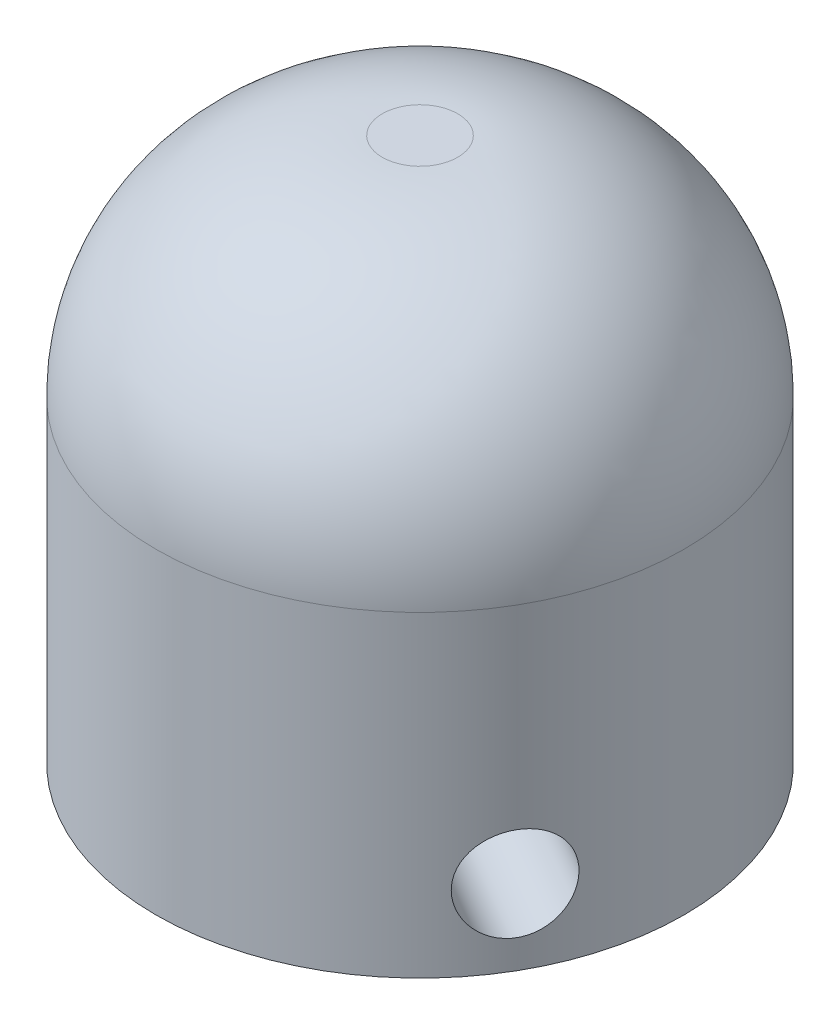
ISO-10303-21;
HEADER;
FILE_DESCRIPTION(('STEP AP214'),'2;1');
FILE_NAME('part.step','',(''),(''),'','','');
FILE_SCHEMA(('AUTOMOTIVE_DESIGN { 1 0 10303 214 1 1 1 1 }'));
ENDSEC;
DATA;
#1=APPLICATION_CONTEXT('core data for automotive mechanical design processes');
#2=APPLICATION_PROTOCOL_DEFINITION('international standard','automotive_design',2000,#1);
#3=PRODUCT_CONTEXT('',#1,'mechanical');
#4=PRODUCT('Part','Part','',(#3));
#5=PRODUCT_RELATED_PRODUCT_CATEGORY('part','',(#4));
#6=PRODUCT_DEFINITION_FORMATION('','',#4);
#7=PRODUCT_DEFINITION_CONTEXT('part definition',#1,'design');
#8=PRODUCT_DEFINITION('design','',#6,#7);
#9=PRODUCT_DEFINITION_SHAPE('','',#8);
#10=(LENGTH_UNIT() NAMED_UNIT(*) SI_UNIT(.MILLI.,.METRE.));
#11=(NAMED_UNIT(*) PLANE_ANGLE_UNIT() SI_UNIT($,.RADIAN.));
#12=(NAMED_UNIT(*) SI_UNIT($,.STERADIAN.) SOLID_ANGLE_UNIT());
#13=UNCERTAINTY_MEASURE_WITH_UNIT(LENGTH_MEASURE(1.E-05),#10,'distance_accuracy_value','');
#14=(GEOMETRIC_REPRESENTATION_CONTEXT(3) GLOBAL_UNCERTAINTY_ASSIGNED_CONTEXT((#13)) GLOBAL_UNIT_ASSIGNED_CONTEXT((#10,
#11,#12)) REPRESENTATION_CONTEXT('',''));
#15=CARTESIAN_POINT('',(0.,0.,0.));
#16=DIRECTION('',(0.,0.,1.));
#17=DIRECTION('',(1.,0.,0.));
#18=AXIS2_PLACEMENT_3D('',#15,#16,#17);
#19=CARTESIAN_POINT('',(0.,35.9903810567665,0.));
#20=DIRECTION('',(0.,1.,0.));
#21=DIRECTION('',(0.,0.,1.));
#22=AXIS2_PLACEMENT_3D('',#19,#20,#21);
#23=PLANE('',#22);
#24=CARTESIAN_POINT('',(0.,35.9903810567665,0.));
#25=DIRECTION('',(0.,1.,0.));
#26=DIRECTION('',(0.,0.,1.));
#27=AXIS2_PLACEMENT_3D('',#24,#25,#26);
#28=CIRCLE('',#27,2.5);
#29=CARTESIAN_POINT('',(0.,35.9903810567665,2.5));
#30=VERTEX_POINT('',#29);
#31=EDGE_CURVE('E11',#30,#30,#28,.T.);
#32=ORIENTED_EDGE('',*,*,#31,.T.);
#33=EDGE_LOOP('',(#32));
#34=FACE_BOUND('',#33,.T.);
#35=ADVANCED_FACE('F33',(#34),#23,.T.);
#36=CARTESIAN_POINT('',(0.,0.,0.));
#37=DIRECTION('',(0.,-1.,0.));
#38=DIRECTION('',(0.,0.,-1.));
#39=AXIS2_PLACEMENT_3D('',#36,#37,#38);
#40=CYLINDRICAL_SURFACE('',#39,17.5);
#41=CARTESIAN_POINT('',(0.,20.9903810567665,0.));
#42=DIRECTION('',(0.,1.,0.));
#43=DIRECTION('',(0.,0.,1.));
#44=AXIS2_PLACEMENT_3D('',#41,#42,#43);
#45=CIRCLE('',#44,17.5);
#46=CARTESIAN_POINT('',(0.,20.9903810567665,17.5));
#47=VERTEX_POINT('',#46);
#48=EDGE_CURVE('E40',#47,#47,#45,.F.);
#49=ORIENTED_EDGE('',*,*,#48,.T.);
#50=EDGE_LOOP('',(#49));
#51=FACE_BOUND('',#50,.T.);
#52=CARTESIAN_POINT('',(-15.1554445662278,8.1,8.74999999999986));
#53=CARTESIAN_POINT('',(-15.2417820479246,8.09999322777987,8.60045298639503));
#54=CARTESIAN_POINT('',(-15.3259334918145,8.08552295754015,8.44953976264709));
#55=CARTESIAN_POINT('',(-15.4875797478547,8.02805471124324,8.14947833958834));
#56=CARTESIAN_POINT('',(-15.5650686163546,7.9850315555295,8.00033181652896));
#57=CARTESIAN_POINT('',(-15.7116253248353,7.87180661171829,7.70853243627809));
#58=CARTESIAN_POINT('',(-15.7807003383229,7.80162819201587,7.56587411332213));
#59=CARTESIAN_POINT('',(-15.909420644273,7.63614858520618,7.2913205109295));
#60=CARTESIAN_POINT('',(-15.9690668592936,7.54084985842512,7.15942417910065));
#61=CARTESIAN_POINT('',(-16.0788881502649,7.32674685067589,6.90928514203029));
#62=CARTESIAN_POINT('',(-16.1289665986782,7.2077252753214,6.79118598371038));
#63=CARTESIAN_POINT('',(-16.2187074540842,6.95002276055288,6.57399203234935));
#64=CARTESIAN_POINT('',(-16.2583691605673,6.81134049995379,6.47489851752872));
#65=CARTESIAN_POINT('',(-16.3275196989504,6.51705061892162,6.29850541934801));
#66=CARTESIAN_POINT('',(-16.3569352862118,6.36133118918651,6.22136344592394));
#67=CARTESIAN_POINT('',(-16.4053112213827,6.03813831609258,6.09266123389642));
#68=CARTESIAN_POINT('',(-16.4242723702447,5.87066577429098,6.04109903556363));
#69=CARTESIAN_POINT('',(-16.4517177077557,5.53055916978101,5.96595206894152));
#70=CARTESIAN_POINT('',(-16.4603084286591,5.3579965774798,5.94208291914247));
#71=CARTESIAN_POINT('',(-16.4674333391695,5.01107755870246,5.92231011886453));
#72=CARTESIAN_POINT('',(-16.4659683329282,4.83672127678028,5.9264042321762));
#73=CARTESIAN_POINT('',(-16.4530486489479,4.49331801846067,5.96217521759061));
#74=CARTESIAN_POINT('',(-16.441711048418,4.32423279112567,5.99352881785334));
#75=CARTESIAN_POINT('',(-16.4091246515356,3.99400745816796,6.08217380620037));
#76=CARTESIAN_POINT('',(-16.3878754753201,3.83286765731691,6.13946618839078));
#77=CARTESIAN_POINT('',(-16.3352082110285,3.52210520378114,6.27825477445738));
#78=CARTESIAN_POINT('',(-16.3037359199212,3.37254932321537,6.35987979603029));
#79=CARTESIAN_POINT('',(-16.2305651018696,3.08993446119829,6.54435427795358));
#80=CARTESIAN_POINT('',(-16.1888656453205,2.956876981036,6.64720566755373));
#81=CARTESIAN_POINT('',(-16.094617277954,2.70907828164315,6.87228885944131));
#82=CARTESIAN_POINT('',(-16.0419243341542,2.59462028378147,6.99477236325941));
#83=CARTESIAN_POINT('',(-15.9263617299006,2.38950341571159,7.25404113598676));
#84=CARTESIAN_POINT('',(-15.8634919871223,2.29884473804165,7.39082652058677));
#85=CARTESIAN_POINT('',(-15.7282227495744,2.1438664506886,7.67448329895881));
#86=CARTESIAN_POINT('',(-15.6558135201002,2.07957402623888,7.82136492135094));
#87=CARTESIAN_POINT('',(-15.502789283047,1.97942755674712,8.12045026280921));
#88=CARTESIAN_POINT('',(-15.4221750530016,1.94357081986927,8.27265347668768));
#89=CARTESIAN_POINT('',(-15.2557401388279,1.90170252244976,8.57565578072303));
#90=CARTESIAN_POINT('',(-15.1700024103793,1.89530252748827,8.72644681967691));
#91=CARTESIAN_POINT('',(-14.9947676667449,1.91149070016137,9.02423334178259));
#92=CARTESIAN_POINT('',(-14.9052708158457,1.93407760224012,9.17122899035371));
#93=CARTESIAN_POINT('',(-14.7259940898605,2.00727537073196,9.45638870894169));
#94=CARTESIAN_POINT('',(-14.6362204254473,2.05769185502988,9.59460670431768));
#95=CARTESIAN_POINT('',(-14.4588660986888,2.18490890230455,9.85985140073953));
#96=CARTESIAN_POINT('',(-14.3712855727728,2.26171110231314,9.98687740679352));
#97=CARTESIAN_POINT('',(-14.2007025619413,2.44039443187866,10.2280056419099));
#98=CARTESIAN_POINT('',(-14.1177537969066,2.54251561907226,10.3419679319803));
#99=CARTESIAN_POINT('',(-13.9606709513426,2.76861050590975,10.5530569225806));
#100=CARTESIAN_POINT('',(-13.8865376006607,2.89258601281425,10.650182229444));
#101=CARTESIAN_POINT('',(-13.7494108108952,3.16062066100812,10.8266508208191));
#102=CARTESIAN_POINT('',(-13.6865588473049,3.30489913030973,10.9057712175324));
#103=CARTESIAN_POINT('',(-13.5759814530026,3.6084257696733,11.0431216110718));
#104=CARTESIAN_POINT('',(-13.5282554999732,3.76767342258713,11.1013523292501));
#105=CARTESIAN_POINT('',(-13.4504483293857,4.09591369476502,11.1954981104349));
#106=CARTESIAN_POINT('',(-13.4202880285956,4.26485881564327,11.2315132354532));
#107=CARTESIAN_POINT('',(-13.3788291722728,4.60828055228973,11.2808681875322));
#108=CARTESIAN_POINT('',(-13.3675287411066,4.78275661624107,11.2942102694531));
#109=CARTESIAN_POINT('',(-13.3644037360474,5.12964980084326,11.297907518837));
#110=CARTESIAN_POINT('',(-13.3723061409326,5.30206116648191,11.2885849261952));
#111=CARTESIAN_POINT('',(-13.4066073457234,5.64236479588035,11.2478254476681));
#112=CARTESIAN_POINT('',(-13.433006062159,5.81025708003029,11.2163886615797));
#113=CARTESIAN_POINT('',(-13.502919359495,6.13656521725581,11.1321218426897));
#114=CARTESIAN_POINT('',(-13.5464084685195,6.29499477081708,11.0793236439385));
#115=CARTESIAN_POINT('',(-13.6484283144127,6.59835273241795,10.9533986659335));
#116=CARTESIAN_POINT('',(-13.7069599539737,6.74328032950272,10.8802706666803));
#117=CARTESIAN_POINT('',(-13.837309190252,7.01761142250047,10.7140165050136));
#118=CARTESIAN_POINT('',(-13.9092941488813,7.14678113718678,10.6206357443457));
#119=CARTESIAN_POINT('',(-14.0629269659538,7.38381748474896,10.4163518224946));
#120=CARTESIAN_POINT('',(-14.1445770438729,7.49167920927066,10.3054446346163));
#121=CARTESIAN_POINT('',(-14.3148768403992,7.68382666122884,10.0675641177387));
#122=CARTESIAN_POINT('',(-14.4035768171296,7.76791915535067,9.94047064567867));
#123=CARTESIAN_POINT('',(-14.583892418577,7.9088373906953,9.67397881174471));
#124=CARTESIAN_POINT('',(-14.6755051275477,7.96568953762116,9.53459252190264));
#125=CARTESIAN_POINT('',(-14.8326065638476,8.03856027749216,9.28756408831413));
#126=CARTESIAN_POINT('',(-14.8982077614067,8.06156207947105,9.18199788432531));
#127=CARTESIAN_POINT('',(-15.0280766984198,8.0922842550959,8.96786433085468));
#128=CARTESIAN_POINT('',(-15.0923444658354,8.10000494950468,8.85929704441651));
#129=CARTESIAN_POINT('',(-15.1554445662278,8.1,8.74999999999986));
#130=B_SPLINE_CURVE_WITH_KNOTS('',3,(#52,#53,#54,#55,#56,#57,#58,#59,#60,#61,#62,#63,#64,#65,
#66,#67,#68,#69,#70,#71,#72,#73,#74,#75,#76,#77,#78,#79,#80,#81,#82,#83,#84,#85,#86,#87,#88,#89,
#90,#91,#92,#93,#94,#95,#96,#97,#98,#99,#100,#101,#102,#103,#104,#105,#106,#107,#108,#109,#110,
#111,#112,#113,#114,#115,#116,#117,#118,#119,#120,#121,#122,#123,#124,#125,#126,#127,#128,#129),
.UNSPECIFIED.,.T.,.F.,(4,2,2,2,2,2,2,2,2,2,2,2,2,2,2,2,2,2,2,2,2,2,2,2,2,2,2,2,2,2,2,2,2,2,2,2,
2,2,4),(0.,0.517579340975336,1.03561572220724,1.55320729639994,2.0707481956046,2.5932676070605,
3.11582214813436,3.64203900788229,4.16821554663686,4.68893953774941,5.20962188728867,
5.72421238278261,6.23882260167246,6.75620708372197,7.27363861121162,7.79833094846839,
8.32302753039414,8.84826375488365,9.37345025247608,9.8916910981442,10.4099093184027,
10.924552904673,11.4392284264091,11.9589840234571,12.4787826222947,13.0047028338504,
13.5306048828415,14.0541205635889,14.5775841770534,15.0936489661138,15.6097114262919,
16.1250076357004,16.6403347749161,17.1625602626801,17.6849059066088,18.2113832730641,
18.7373492557209,19.115632167171,19.4939071380722),.UNSPECIFIED.);
#131=CARTESIAN_POINT('',(-15.1554445662278,8.1,8.74999999999986));
#132=VERTEX_POINT('',#131);
#133=EDGE_CURVE('E134',#132,#132,#130,.T.);
#134=ORIENTED_EDGE('',*,*,#133,.F.);
#135=EDGE_LOOP('',(#134));
#136=FACE_BOUND('',#135,.T.);
#137=CARTESIAN_POINT('',(15.1554445662276,8.1,8.75000000000007));
#138=CARTESIAN_POINT('',(15.0691017942342,8.09999322777987,8.89954395925073));
#139=CARTESIAN_POINT('',(14.9804828306464,8.08552295754015,9.04787785929845));
#140=CARTESIAN_POINT('',(14.8014451436019,8.02805471124324,9.33789833498532));
#141=CARTESIAN_POINT('',(14.7110248999963,7.9850315555295,9.47957892514645));
#142=CARTESIAN_POINT('',(14.5315975781309,7.8718066117183,9.7524004479112));
#143=CARTESIAN_POINT('',(14.4425893531335,7.80162819201588,9.88355032583616));
#144=CARTESIAN_POINT('',(14.269179111736,7.63614858520618,10.1323021819682));
#145=CARTESIAN_POINT('',(14.1847766452165,7.54084985842512,10.24990548533));
#146=CARTESIAN_POINT('',(14.0230605301211,7.32674685067589,10.4700830317228));
#147=CARTESIAN_POINT('',(13.9458228830572,7.2077252753214,10.5725018193908));
#148=CARTESIAN_POINT('',(13.8025978313332,6.95002276055288,10.7588166556102));
#149=CARTESIAN_POINT('',(13.7366111833898,6.81134049995379,10.8427114583924));
#150=CARTESIAN_POINT('',(13.6184255485046,6.51705061892162,10.9907941304079));
#151=CARTESIAN_POINT('',(13.566326433452,6.36133118918651,11.0548397629555));
#152=CARTESIAN_POINT('',(13.4790550158983,6.03813831609258,11.161085657759));
#153=CARTESIAN_POINT('',(13.4438814166982,5.87066577429098,11.2032875935249));
#154=CARTESIAN_POINT('',(13.3925249033416,5.53055916978101,11.2646294363359));
#155=CARTESIAN_POINT('',(13.3761489737006,5.3579965774798,11.2840037937746));
#156=CARTESIAN_POINT('',(13.3625876816111,5.01107755870246,11.3000605474152));
#157=CARTESIAN_POINT('',(13.3654007846244,4.83672127678028,11.2967447581378));
#158=CARTESIAN_POINT('',(13.3899195247215,4.49331801846067,11.2676704908947));
#159=CARTESIAN_POINT('',(13.4114037387841,4.32423279112567,11.2421750406865));
#160=CARTESIAN_POINT('',(13.4718793521696,3.99400745816796,11.169631898995));
#161=CARTESIAN_POINT('',(13.5108714224821,3.83286765731692,11.1225833814877));
#162=CARTESIAN_POINT('',(13.6047322316254,3.52210520378114,11.0075778996301));
#163=CARTESIAN_POINT('',(13.6596854283383,3.37254932321537,10.9395095852294));
#164=CARTESIAN_POINT('',(13.782859607008,3.08993446119828,10.7839045570194));
#165=CARTESIAN_POINT('',(13.8510817949417,2.956876981036,10.6963660735238));
#166=CARTESIAN_POINT('',(13.998885373398,2.70907828164315,10.5022029971754));
#167=CARTESIAN_POINT('',(14.0786127273491,2.59462028378147,10.3953278173355));
#168=CARTESIAN_POINT('',(14.2453647688122,2.38950341571159,10.1656132799607));
#169=CARTESIAN_POINT('',(14.3323895153531,2.29884473804165,10.0427737932854));
#170=CARTESIAN_POINT('',(14.510408872605,2.1438664506886,9.78379880803228));
#171=CARTESIAN_POINT('',(14.6014074742085,2.07957402623887,9.6476497646431));
#172=CARTESIAN_POINT('',(14.7839108592844,1.97942755674712,9.36558421723121));
#173=CARTESIAN_POINT('',(14.8754155940181,1.94357081986927,9.21966863916613));
#174=CARTESIAN_POINT('',(15.054605829631,1.90170252244976,8.92403062339729));
#175=CARTESIAN_POINT('',(15.1423258358038,1.89530252748827,8.77438405302111));
#176=CARTESIAN_POINT('',(15.3125991570347,1.91149070016137,8.47373305235519));
#177=CARTESIAN_POINT('',(15.3951526974935,1.93407760224012,8.32272868163227));
#178=CARTESIAN_POINT('',(15.5524698949341,2.00727537073196,8.02489062332781));
#179=CARTESIAN_POINT('',(15.6272833579833,2.05769185502988,7.8780353516671));
#180=CARTESIAN_POINT('',(15.7683148399244,2.18490890230455,7.59181965101223));
#181=CARTESIAN_POINT('',(15.8345323251505,2.26171110231314,7.4524596876652));
#182=CARTESIAN_POINT('',(15.9580639969153,2.44039443187866,7.18416634927285));
#183=CARTESIAN_POINT('',(16.0152838526723,2.54251561907226,7.05534946650508));
#184=CARTESIAN_POINT('',(16.1195508582093,2.76861050590975,6.81376723644775));
#185=CARTESIAN_POINT('',(16.1665971659625,2.89258601281426,6.70100321805788));
#186=CARTESIAN_POINT('',(16.2508600541807,3.16062066100812,6.494013638894));
#187=CARTESIAN_POINT('',(16.2879543458967,3.30489913030973,6.40002204339049));
#188=CARTESIAN_POINT('',(16.3516145787704,3.6084257696733,6.23558401407061));
#189=CARTESIAN_POINT('',(16.3781808834787,3.76767342258713,6.1651367672382));
#190=CARTESIAN_POINT('',(16.4208099363502,4.09591369476502,6.05068089032047));
#191=CARTESIAN_POINT('',(16.4369197991414,4.26485881564327,6.00655374114129));
#192=CARTESIAN_POINT('',(16.458933013283,4.60828055228973,5.94597184231445));
#193=CARTESIAN_POINT('',(16.4648373795828,4.78275661624107,5.92951434089032));
#194=CARTESIAN_POINT('',(16.4664767889438,5.12964980084326,5.92495938243012));
#195=CARTESIAN_POINT('',(16.4623543893294,5.30206116648191,5.93646436213256));
#196=CARTESIAN_POINT('',(16.4442062478754,5.64236479588035,5.98654981612542));
#197=CARTESIAN_POINT('',(16.4301805507273,5.81025708003029,6.0251301682301));
#198=CARTESIAN_POINT('',(16.3921599935405,6.13656521725581,6.12781026923039));
#199=CARTESIAN_POINT('',(16.3681799666601,6.29499477081708,6.19187204180918));
#200=CARTESIAN_POINT('',(16.3101356596834,6.59835273241795,6.34318630904541));
#201=CARTESIAN_POINT('',(16.2760707743827,6.74328032950272,6.43044019545698));
#202=CARTESIAN_POINT('',(16.1972650650336,7.01761142250047,6.62645302627122));
#203=CARTESIAN_POINT('',(16.1523874333851,7.14678113718678,6.7354842094685));
#204=CARTESIAN_POINT('',(16.0522887760136,7.38381748474896,6.97067609283379));
#205=CARTESIAN_POINT('',(15.9970653728083,7.49167920927066,7.09684072847186));
#206=CARTESIAN_POINT('',(15.87620470039,7.68382666122884,7.36326493696178));
#207=CARTESIAN_POINT('',(15.8104885132961,7.76791915535066,7.50362810615542));
#208=CARTESIAN_POINT('',(15.6698576159319,7.9088373906953,7.79303191467455));
#209=CARTESIAN_POINT('',(15.5949519024747,7.96568953762116,7.94206399287371));
#210=CARTESIAN_POINT('',(15.4595697216799,8.03856027749216,8.20163204447466));
#211=CARTESIAN_POINT('',(15.4009473060241,8.06156207947105,8.31122745007401));
#212=CARTESIAN_POINT('',(15.2804366774224,8.0922842550959,8.5307640254251));
#213=CARTESIAN_POINT('',(15.2185485330548,8.10000494950468,8.64070518787061));
#214=CARTESIAN_POINT('',(15.1554445662276,8.1,8.75000000000007));
#215=B_SPLINE_CURVE_WITH_KNOTS('',3,(#137,#138,#139,#140,#141,#142,#143,#144,#145,#146,#147,
#148,#149,#150,#151,#152,#153,#154,#155,#156,#157,#158,#159,#160,#161,#162,#163,#164,#165,#166,
#167,#168,#169,#170,#171,#172,#173,#174,#175,#176,#177,#178,#179,#180,#181,#182,#183,#184,#185,
#186,#187,#188,#189,#190,#191,#192,#193,#194,#195,#196,#197,#198,#199,#200,#201,#202,#203,#204,
#205,#206,#207,#208,#209,#210,#211,#212,#213,#214),.UNSPECIFIED.,.T.,.F.,(4,2,2,2,2,2,2,2,2,2,2,
2,2,2,2,2,2,2,2,2,2,2,2,2,2,2,2,2,2,2,2,2,2,2,2,2,2,2,4),(0.,0.517579340975335,1.03561572220724,
1.55320729639994,2.0707481956046,2.5932676070605,3.11582214813437,3.64203900788229,
4.16821554663686,4.68893953774941,5.20962188728867,5.72421238278261,6.23882260167247,
6.75620708372198,7.27363861121162,7.79833094846839,8.32302753039414,8.84826375488365,
9.37345025247609,9.89169109814421,10.4099093184027,10.924552904673,11.4392284264091,
11.9589840234571,12.4787826222947,13.0047028338504,13.5306048828415,14.0541205635889,
14.5775841770534,15.0936489661138,15.6097114262919,16.1250076357004,16.6403347749161,
17.1625602626801,17.6849059066088,18.2113832730641,18.7373492557209,19.115632167171,
19.4939071380722),.UNSPECIFIED.);
#216=CARTESIAN_POINT('',(15.1554445662276,8.1,8.75000000000007));
#217=VERTEX_POINT('',#216);
#218=EDGE_CURVE('E91',#217,#217,#215,.T.);
#219=ORIENTED_EDGE('',*,*,#218,.F.);
#220=EDGE_LOOP('',(#219));
#221=FACE_BOUND('',#220,.T.);
#222=CARTESIAN_POINT('',(0.,8.1,-17.5));
#223=CARTESIAN_POINT('',(0.172680253690303,8.09999322777987,-17.4999969456458));
#224=CARTESIAN_POINT('',(0.345450661167951,8.08552295754015,-17.4974176219456));
#225=CARTESIAN_POINT('',(0.68613460425266,8.02805471124324,-17.4873766745737));
#226=CARTESIAN_POINT('',(0.854043716358161,7.9850315555295,-17.4799107416755));
#227=CARTESIAN_POINT('',(1.18002774670431,7.87180661171829,-17.4609328841894));
#228=CARTESIAN_POINT('',(1.33811098518924,7.80162819201587,-17.4494244391584));
#229=CARTESIAN_POINT('',(1.64024153253684,7.63614858520618,-17.4236226928977));
#230=CARTESIAN_POINT('',(1.78429021407691,7.54084985842512,-17.4093296644308));
#231=CARTESIAN_POINT('',(2.05582762014368,7.32674685067589,-17.3793681737531));
#232=CARTESIAN_POINT('',(2.18314371562095,7.2077252753214,-17.3636878031012));
#233=CARTESIAN_POINT('',(2.41610962275091,6.95002276055288,-17.3328086879597));
#234=CARTESIAN_POINT('',(2.52175797717743,6.81134049995379,-17.3176099759212));
#235=CARTESIAN_POINT('',(2.70909415044573,6.51705061892162,-17.289299549756));
#236=CARTESIAN_POINT('',(2.79060885275974,6.36133118918651,-17.2762032088795));
#237=CARTESIAN_POINT('',(2.92625620548422,6.03813831609258,-17.2537468916555));
#238=CARTESIAN_POINT('',(2.9803909535464,5.87066577429098,-17.2443866290886));
#239=CARTESIAN_POINT('',(3.059192804414,5.53055916978101,-17.2305815052775));
#240=CARTESIAN_POINT('',(3.08415945495844,5.3579965774798,-17.2260867129172));
#241=CARTESIAN_POINT('',(3.10484565755825,5.01107755870246,-17.2223706662798));
#242=CARTESIAN_POINT('',(3.10056754830374,4.83672127678028,-17.2231489903141));
#243=CARTESIAN_POINT('',(3.06312912422629,4.49331801846067,-17.2298457084854));
#244=CARTESIAN_POINT('',(3.03030730963372,4.32423279112567,-17.2357038585399));
#245=CARTESIAN_POINT('',(2.9372452993658,3.99400745816796,-17.2518057051955));
#246=CARTESIAN_POINT('',(2.87700405283784,3.83286765731692,-17.2620495698786));
#247=CARTESIAN_POINT('',(2.73047597940308,3.52210520378114,-17.2858326740876));
#248=CARTESIAN_POINT('',(2.64405049158282,3.37254932321537,-17.2993893812598));
#249=CARTESIAN_POINT('',(2.44770549486147,3.08993446119828,-17.3282588349731));
#250=CARTESIAN_POINT('',(2.33778385037864,2.956876981036,-17.3435717410776));
#251=CARTESIAN_POINT('',(2.09573190455587,2.70907828164315,-17.3744918566168));
#252=CARTESIAN_POINT('',(1.96331160680498,2.59462028378147,-17.390100180595));
#253=CARTESIAN_POINT('',(1.68099696108827,2.38950341571159,-17.4196544159476));
#254=CARTESIAN_POINT('',(1.5311024717691,2.29884473804165,-17.4336003138722));
#255=CARTESIAN_POINT('',(1.2178138769693,2.1438664506886,-17.4582821069912));
#256=CARTESIAN_POINT('',(1.05440604589154,2.07957402623888,-17.4690146859941));
#257=CARTESIAN_POINT('',(0.718878423762563,1.97942755674712,-17.4860344800405));
#258=CARTESIAN_POINT('',(0.546759458983464,1.94357081986927,-17.4923221158539));
#259=CARTESIAN_POINT('',(0.201134309196753,1.90170252244976,-17.4996864041204));
#260=CARTESIAN_POINT('',(0.0276765745753535,1.89530252748827,-17.5008308726981));
#261=CARTESIAN_POINT('',(-0.317831490289996,1.91149070016137,-17.4979663941378));
#262=CARTESIAN_POINT('',(-0.489881881647929,1.93407760224012,-17.493957671986));
#263=CARTESIAN_POINT('',(-0.826475805073731,2.00727537073196,-17.4812793322696));
#264=CARTESIAN_POINT('',(-0.991062932536133,2.05769185502988,-17.4726420559848));
#265=CARTESIAN_POINT('',(-1.3094487412358,2.18490890230455,-17.4516710517518));
#266=CARTESIAN_POINT('',(-1.46324675237781,2.26171110231314,-17.4393370944588));
#267=CARTESIAN_POINT('',(-1.75736143497411,2.44039443187866,-17.4121719911829));
#268=CARTESIAN_POINT('',(-1.89753005576585,2.54251561907226,-17.3973173984855));
#269=CARTESIAN_POINT('',(-2.1588799068669,2.76861050590975,-17.3668241590284));
#270=CARTESIAN_POINT('',(-2.28005956530194,2.89258601281425,-17.351185447502));
#271=CARTESIAN_POINT('',(-2.50144924328558,3.16062066100812,-17.3206644597132));
#272=CARTESIAN_POINT('',(-2.60139549859185,3.30489913030973,-17.3057932609229));
#273=CARTESIAN_POINT('',(-2.775633125768,3.6084257696733,-17.2787056251425));
#274=CARTESIAN_POINT('',(-2.8499253835057,3.76767342258713,-17.2664890964883));
#275=CARTESIAN_POINT('',(-2.97036160696462,4.09591369476502,-17.2461790007555));
#276=CARTESIAN_POINT('',(-3.01663177054597,4.26485881564327,-17.2380669765945));
#277=CARTESIAN_POINT('',(-3.08010384101031,4.60828055228973,-17.2268400298466));
#278=CARTESIAN_POINT('',(-3.0973086384763,4.78275661624107,-17.2237246103434));
#279=CARTESIAN_POINT('',(-3.10207305289655,5.12964980084326,-17.2228669012672));
#280=CARTESIAN_POINT('',(-3.09004824839703,5.30206116648191,-17.2250492883278));
#281=CARTESIAN_POINT('',(-3.0375989021521,5.64236479588035,-17.2343752637936));
#282=CARTESIAN_POINT('',(-2.99717448856845,5.81025708003029,-17.2415188298099));
#283=CARTESIAN_POINT('',(-2.88924063404562,6.13656521725581,-17.2599321119202));
#284=CARTESIAN_POINT('',(-2.82177149814075,6.29499477081708,-17.2711956857477));
#285=CARTESIAN_POINT('',(-2.66170734527078,6.59835273241795,-17.2965849749789));
#286=CARTESIAN_POINT('',(-2.56911082040911,6.74328032950272,-17.3107108621373));
#287=CARTESIAN_POINT('',(-2.35995587478171,7.01761142250047,-17.3404695312849));
#288=CARTESIAN_POINT('',(-2.24309328450396,7.14678113718678,-17.3561199538143));
#289=CARTESIAN_POINT('',(-1.98936181005997,7.38381748474896,-17.3870279153285));
#290=CARTESIAN_POINT('',(-1.85248832893551,7.49167920927066,-17.4022853630882));
#291=CARTESIAN_POINT('',(-1.56132785999097,7.68382666122884,-17.4308290547005));
#292=CARTESIAN_POINT('',(-1.4069116961666,7.76791915535066,-17.4440987518341));
#293=CARTESIAN_POINT('',(-1.08596519735497,7.9088373906953,-17.4670107264193));
#294=CARTESIAN_POINT('',(-0.919446774927135,7.96568953762116,-17.4766565147764));
#295=CARTESIAN_POINT('',(-0.626963157832478,8.03856027749216,-17.4891961327889));
#296=CARTESIAN_POINT('',(-0.50273954461748,8.06156207947105,-17.4932253343994));
#297=CARTESIAN_POINT('',(-0.252359979002755,8.0922842550959,-17.4986283562798));
#298=CARTESIAN_POINT('',(-0.126204067219559,8.10000494950468,-17.5000022322872));
#299=CARTESIAN_POINT('',(0.,8.1,-17.5));
#300=B_SPLINE_CURVE_WITH_KNOTS('',3,(#222,#223,#224,#225,#226,#227,#228,#229,#230,#231,#232,
#233,#234,#235,#236,#237,#238,#239,#240,#241,#242,#243,#244,#245,#246,#247,#248,#249,#250,#251,
#252,#253,#254,#255,#256,#257,#258,#259,#260,#261,#262,#263,#264,#265,#266,#267,#268,#269,#270,
#271,#272,#273,#274,#275,#276,#277,#278,#279,#280,#281,#282,#283,#284,#285,#286,#287,#288,#289,
#290,#291,#292,#293,#294,#295,#296,#297,#298,#299),.UNSPECIFIED.,.T.,.F.,(4,2,2,2,2,2,2,2,2,2,2,
2,2,2,2,2,2,2,2,2,2,2,2,2,2,2,2,2,2,2,2,2,2,2,2,2,2,2,4),(0.,0.517579340975336,1.03561572220724,
1.55320729639994,2.0707481956046,2.5932676070605,3.11582214813436,3.64203900788229,
4.16821554663686,4.68893953774941,5.20962188728867,5.7242123827826,6.23882260167246,
6.75620708372197,7.27363861121162,7.79833094846839,8.32302753039414,8.84826375488365,
9.37345025247608,9.8916910981442,10.4099093184027,10.924552904673,11.4392284264091,
11.9589840234571,12.4787826222946,13.0047028338503,13.5306048828415,14.0541205635889,
14.5775841770534,15.0936489661138,15.6097114262919,16.1250076357004,16.6403347749161,
17.16256026268,17.6849059066088,18.2113832730641,18.7373492557209,19.115632167171,
19.4939071380722),.UNSPECIFIED.);
#301=CARTESIAN_POINT('',(0.,8.1,-17.5));
#302=VERTEX_POINT('',#301);
#303=EDGE_CURVE('E71',#302,#302,#300,.T.);
#304=ORIENTED_EDGE('',*,*,#303,.F.);
#305=EDGE_LOOP('',(#304));
#306=FACE_BOUND('',#305,.T.);
#307=CARTESIAN_POINT('',(0.,0.,0.));
#308=DIRECTION('',(0.,-1.,0.));
#309=DIRECTION('',(0.,0.,-1.));
#310=AXIS2_PLACEMENT_3D('',#307,#308,#309);
#311=CIRCLE('',#310,17.5);
#312=CARTESIAN_POINT('',(0.,0.,-17.5));
#313=VERTEX_POINT('',#312);
#314=EDGE_CURVE('E78',#313,#313,#311,.T.);
#315=ORIENTED_EDGE('',*,*,#314,.F.);
#316=EDGE_LOOP('',(#315));
#317=FACE_BOUND('',#316,.T.);
#318=ADVANCED_FACE('F61',(#51,#136,#221,#306,#317),#40,.T.);
#319=CARTESIAN_POINT('',(17.5,0.,0.));
#320=DIRECTION('',(0.,-1.,0.));
#321=DIRECTION('',(0.,0.,-1.));
#322=AXIS2_PLACEMENT_3D('',#319,#320,#321);
#323=PLANE('',#322);
#324=ORIENTED_EDGE('',*,*,#314,.T.);
#325=EDGE_LOOP('',(#324));
#326=FACE_BOUND('',#325,.T.);
#327=CARTESIAN_POINT('',(0.,0.,0.));
#328=DIRECTION('',(0.,-1.,0.));
#329=DIRECTION('',(0.,0.,-1.));
#330=AXIS2_PLACEMENT_3D('',#327,#328,#329);
#331=CIRCLE('',#330,7.5);
#332=CARTESIAN_POINT('',(0.,0.,-7.5));
#333=VERTEX_POINT('',#332);
#334=EDGE_CURVE('E104',#333,#333,#331,.T.);
#335=ORIENTED_EDGE('',*,*,#334,.F.);
#336=EDGE_LOOP('',(#335));
#337=FACE_BOUND('',#336,.T.);
#338=ADVANCED_FACE('F56',(#326,#337),#323,.T.);
#339=CARTESIAN_POINT('',(0.,0.,0.));
#340=DIRECTION('',(0.,-1.,0.));
#341=DIRECTION('',(0.,0.,-1.));
#342=AXIS2_PLACEMENT_3D('',#339,#340,#341);
#343=CYLINDRICAL_SURFACE('',#342,7.5);
#344=ORIENTED_EDGE('',*,*,#334,.T.);
#345=EDGE_LOOP('',(#344));
#346=FACE_BOUND('',#345,.T.);
#347=CARTESIAN_POINT('',(0.,20.,0.));
#348=DIRECTION('',(0.,-1.,0.));
#349=DIRECTION('',(0.,0.,-1.));
#350=AXIS2_PLACEMENT_3D('',#347,#348,#349);
#351=CIRCLE('',#350,7.5);
#352=CARTESIAN_POINT('',(0.,20.,-7.5));
#353=VERTEX_POINT('',#352);
#354=EDGE_CURVE('E76',#353,#353,#351,.T.);
#355=ORIENTED_EDGE('',*,*,#354,.F.);
#356=EDGE_LOOP('',(#355));
#357=FACE_BOUND('',#356,.T.);
#358=ADVANCED_FACE('F46',(#346,#357),#343,.F.);
#359=CARTESIAN_POINT('',(0.,32.9903810567665,0.));
#360=DIRECTION('',(0.,-1.,0.));
#361=DIRECTION('',(0.,0.,-1.));
#362=AXIS2_PLACEMENT_3D('',#359,#360,#361);
#363=CONICAL_SURFACE('',#362,0.,0.5235987755983);
#364=ORIENTED_EDGE('',*,*,#354,.T.);
#365=EDGE_LOOP('',(#364));
#366=FACE_BOUND('',#365,.T.);
#367=CARTESIAN_POINT('',(0.,32.9903810567665,0.));
#368=VERTEX_POINT('',#367);
#369=VERTEX_LOOP('',#368);
#370=FACE_BOUND('',#369,.T.);
#371=ADVANCED_FACE('F43',(#366,#370),#363,.F.);
#372=CARTESIAN_POINT('',(0.,5.,-38.));
#373=DIRECTION('',(0.,0.,1.));
#374=DIRECTION('',(1.,0.,0.));
#375=AXIS2_PLACEMENT_3D('',#372,#373,#374);
#376=CYLINDRICAL_SURFACE('',#375,3.1);
#377=ORIENTED_EDGE('',*,*,#303,.T.);
#378=EDGE_LOOP('',(#377));
#379=FACE_BOUND('',#378,.T.);
#380=CARTESIAN_POINT('',(0.,5.,-8.));
#381=DIRECTION('',(0.,0.,1.));
#382=DIRECTION('',(1.,0.,0.));
#383=AXIS2_PLACEMENT_3D('',#380,#381,#382);
#384=CIRCLE('',#383,3.1);
#385=CARTESIAN_POINT('',(3.1,5.,-8.));
#386=VERTEX_POINT('',#385);
#387=EDGE_CURVE('E77',#386,#386,#384,.T.);
#388=ORIENTED_EDGE('',*,*,#387,.T.);
#389=EDGE_LOOP('',(#388));
#390=FACE_BOUND('',#389,.T.);
#391=ADVANCED_FACE('F45',(#379,#390),#376,.F.);
#392=CARTESIAN_POINT('',(0.,5.,-8.));
#393=DIRECTION('',(0.,0.,1.));
#394=DIRECTION('',(1.,0.,0.));
#395=AXIS2_PLACEMENT_3D('',#392,#393,#394);
#396=PLANE('',#395);
#397=ORIENTED_EDGE('',*,*,#387,.F.);
#398=EDGE_LOOP('',(#397));
#399=FACE_BOUND('',#398,.T.);
#400=ADVANCED_FACE('F53',(#399),#396,.F.);
#401=CARTESIAN_POINT('',(32.9089653438086,5.,19.0000000000002));
#402=DIRECTION('',(-0.866025403784436,0.,-0.500000000000004));
#403=DIRECTION('',(-0.500000000000004,0.,0.866025403784436));
#404=AXIS2_PLACEMENT_3D('',#401,#402,#403);
#405=CYLINDRICAL_SURFACE('',#404,3.1);
#406=ORIENTED_EDGE('',*,*,#218,.T.);
#407=EDGE_LOOP('',(#406));
#408=FACE_BOUND('',#407,.T.);
#409=CARTESIAN_POINT('',(6.92820323027549,5.,4.00000000000003));
#410=DIRECTION('',(-0.866025403784436,0.,-0.500000000000004));
#411=DIRECTION('',(-0.500000000000004,0.,0.866025403784436));
#412=AXIS2_PLACEMENT_3D('',#409,#410,#411);
#413=CIRCLE('',#412,3.1);
#414=CARTESIAN_POINT('',(5.37820323027548,5.,6.68467875173179));
#415=VERTEX_POINT('',#414);
#416=EDGE_CURVE('E97',#415,#415,#413,.T.);
#417=ORIENTED_EDGE('',*,*,#416,.T.);
#418=EDGE_LOOP('',(#417));
#419=FACE_BOUND('',#418,.T.);
#420=ADVANCED_FACE('F84',(#408,#419),#405,.F.);
#421=CARTESIAN_POINT('',(6.92820323027549,5.,4.00000000000003));
#422=DIRECTION('',(-0.866025403784436,0.,-0.500000000000004));
#423=DIRECTION('',(-0.500000000000004,0.,0.866025403784436));
#424=AXIS2_PLACEMENT_3D('',#421,#422,#423);
#425=PLANE('',#424);
#426=ORIENTED_EDGE('',*,*,#416,.F.);
#427=EDGE_LOOP('',(#426));
#428=FACE_BOUND('',#427,.T.);
#429=ADVANCED_FACE('F127',(#428),#425,.F.);
#430=CARTESIAN_POINT('',(-32.9089653438088,5.,18.9999999999997));
#431=DIRECTION('',(0.866025403784443,0.,-0.499999999999992));
#432=DIRECTION('',(-0.499999999999992,0.,-0.866025403784443));
#433=AXIS2_PLACEMENT_3D('',#430,#431,#432);
#434=CYLINDRICAL_SURFACE('',#433,3.1);
#435=ORIENTED_EDGE('',*,*,#133,.T.);
#436=EDGE_LOOP('',(#435));
#437=FACE_BOUND('',#436,.T.);
#438=CARTESIAN_POINT('',(-6.92820323027555,5.,3.99999999999994));
#439=DIRECTION('',(0.866025403784443,0.,-0.499999999999992));
#440=DIRECTION('',(-0.499999999999992,0.,-0.866025403784443));
#441=AXIS2_PLACEMENT_3D('',#438,#439,#440);
#442=CIRCLE('',#441,3.1);
#443=CARTESIAN_POINT('',(-8.47820323027552,5.,1.31532124826816));
#444=VERTEX_POINT('',#443);
#445=EDGE_CURVE('E98',#444,#444,#442,.T.);
#446=ORIENTED_EDGE('',*,*,#445,.T.);
#447=EDGE_LOOP('',(#446));
#448=FACE_BOUND('',#447,.T.);
#449=ADVANCED_FACE('F120',(#437,#448),#434,.F.);
#450=CARTESIAN_POINT('',(-6.92820323027555,5.,3.99999999999994));
#451=DIRECTION('',(0.866025403784443,0.,-0.499999999999992));
#452=DIRECTION('',(-0.499999999999992,0.,-0.866025403784443));
#453=AXIS2_PLACEMENT_3D('',#450,#451,#452);
#454=PLANE('',#453);
#455=ORIENTED_EDGE('',*,*,#445,.F.);
#456=EDGE_LOOP('',(#455));
#457=FACE_BOUND('',#456,.T.);
#458=ADVANCED_FACE('F115',(#457),#454,.F.);
#459=CARTESIAN_POINT('',(0.,20.9903810567665,0.));
#460=DIRECTION('',(0.,1.,0.));
#461=DIRECTION('',(0.,0.,1.));
#462=AXIS2_PLACEMENT_3D('',#459,#460,#461);
#463=DEGENERATE_TOROIDAL_SURFACE('',#462,2.5,15.,.T.);
#464=ORIENTED_EDGE('',*,*,#31,.F.);
#465=EDGE_LOOP('',(#464));
#466=FACE_BOUND('',#465,.T.);
#467=ORIENTED_EDGE('',*,*,#48,.F.);
#468=EDGE_LOOP('',(#467));
#469=FACE_BOUND('',#468,.T.);
#470=ADVANCED_FACE('F35',(#466,#469),#463,.T.);
#471=CLOSED_SHELL('',(#35,#318,#338,#358,#371,#391,#400,#420,#429,#449,#458,#470));
#472=MANIFOLD_SOLID_BREP('B2',#471);
#473=ADVANCED_BREP_SHAPE_REPRESENTATION('',(#18,#472),#14);
#474=SHAPE_DEFINITION_REPRESENTATION(#9,#473);
ENDSEC;
END-ISO-10303-21;
